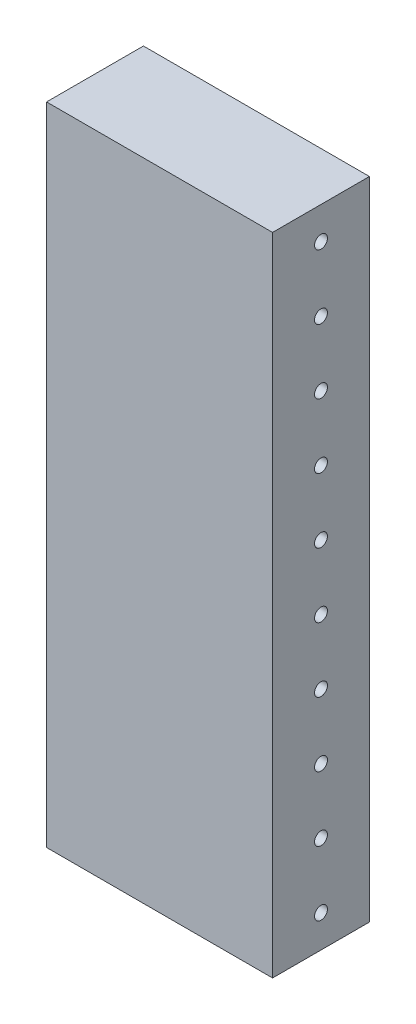
ISO-10303-21;
HEADER;
FILE_DESCRIPTION(('STEP AP214'),'2;1');
FILE_NAME('part.step','',(''),(''),'','','');
FILE_SCHEMA(('AUTOMOTIVE_DESIGN { 1 0 10303 214 1 1 1 1 }'));
ENDSEC;
DATA;
#1=APPLICATION_CONTEXT('core data for automotive mechanical design processes');
#2=APPLICATION_PROTOCOL_DEFINITION('international standard','automotive_design',2000,#1);
#3=PRODUCT_CONTEXT('',#1,'mechanical');
#4=PRODUCT('Part','Part','',(#3));
#5=PRODUCT_RELATED_PRODUCT_CATEGORY('part','',(#4));
#6=PRODUCT_DEFINITION_FORMATION('','',#4);
#7=PRODUCT_DEFINITION_CONTEXT('part definition',#1,'design');
#8=PRODUCT_DEFINITION('design','',#6,#7);
#9=PRODUCT_DEFINITION_SHAPE('','',#8);
#10=(LENGTH_UNIT() NAMED_UNIT(*) SI_UNIT(.MILLI.,.METRE.));
#11=(NAMED_UNIT(*) PLANE_ANGLE_UNIT() SI_UNIT($,.RADIAN.));
#12=(NAMED_UNIT(*) SI_UNIT($,.STERADIAN.) SOLID_ANGLE_UNIT());
#13=UNCERTAINTY_MEASURE_WITH_UNIT(LENGTH_MEASURE(1.E-05),#10,'distance_accuracy_value','');
#14=(GEOMETRIC_REPRESENTATION_CONTEXT(3) GLOBAL_UNCERTAINTY_ASSIGNED_CONTEXT((#13)) GLOBAL_UNIT_ASSIGNED_CONTEXT((#10,
#11,#12)) REPRESENTATION_CONTEXT('',''));
#15=CARTESIAN_POINT('',(0.,0.,0.));
#16=DIRECTION('',(0.,0.,1.));
#17=DIRECTION('',(1.,0.,0.));
#18=AXIS2_PLACEMENT_3D('',#15,#16,#17);
#19=CARTESIAN_POINT('',(0.,254.,0.));
#20=DIRECTION('',(1.,0.,0.));
#21=DIRECTION('',(0.,0.,-1.));
#22=AXIS2_PLACEMENT_3D('',#19,#20,#21);
#23=PLANE('',#22);
#24=CARTESIAN_POINT('',(0.,12.7,19.05));
#25=DIRECTION('',(-1.,0.,0.));
#26=DIRECTION('',(0.,0.,1.));
#27=AXIS2_PLACEMENT_3D('',#24,#25,#26);
#28=CIRCLE('',#27,2.54);
#29=CARTESIAN_POINT('',(0.,12.7,21.59));
#30=VERTEX_POINT('',#29);
#31=EDGE_CURVE('E200',#30,#30,#28,.T.);
#32=ORIENTED_EDGE('',*,*,#31,.F.);
#33=EDGE_LOOP('',(#32));
#34=FACE_BOUND('',#33,.T.);
#35=CARTESIAN_POINT('',(0.,38.1,19.05));
#36=DIRECTION('',(-1.,0.,0.));
#37=DIRECTION('',(0.,0.,1.));
#38=AXIS2_PLACEMENT_3D('',#35,#36,#37);
#39=CIRCLE('',#38,2.54);
#40=CARTESIAN_POINT('',(0.,38.1,21.59));
#41=VERTEX_POINT('',#40);
#42=EDGE_CURVE('E192',#41,#41,#39,.T.);
#43=ORIENTED_EDGE('',*,*,#42,.F.);
#44=EDGE_LOOP('',(#43));
#45=FACE_BOUND('',#44,.T.);
#46=CARTESIAN_POINT('',(0.,63.5,19.05));
#47=DIRECTION('',(-1.,0.,0.));
#48=DIRECTION('',(0.,0.,1.));
#49=AXIS2_PLACEMENT_3D('',#46,#47,#48);
#50=CIRCLE('',#49,2.54);
#51=CARTESIAN_POINT('',(0.,63.5,21.59));
#52=VERTEX_POINT('',#51);
#53=EDGE_CURVE('E184',#52,#52,#50,.T.);
#54=ORIENTED_EDGE('',*,*,#53,.F.);
#55=EDGE_LOOP('',(#54));
#56=FACE_BOUND('',#55,.T.);
#57=CARTESIAN_POINT('',(0.,88.9,19.05));
#58=DIRECTION('',(-1.,0.,0.));
#59=DIRECTION('',(0.,0.,1.));
#60=AXIS2_PLACEMENT_3D('',#57,#58,#59);
#61=CIRCLE('',#60,2.54);
#62=CARTESIAN_POINT('',(0.,88.9,21.59));
#63=VERTEX_POINT('',#62);
#64=EDGE_CURVE('E176',#63,#63,#61,.T.);
#65=ORIENTED_EDGE('',*,*,#64,.F.);
#66=EDGE_LOOP('',(#65));
#67=FACE_BOUND('',#66,.T.);
#68=CARTESIAN_POINT('',(0.,114.3,19.05));
#69=DIRECTION('',(-1.,0.,0.));
#70=DIRECTION('',(0.,0.,1.));
#71=AXIS2_PLACEMENT_3D('',#68,#69,#70);
#72=CIRCLE('',#71,2.54);
#73=CARTESIAN_POINT('',(0.,114.3,21.59));
#74=VERTEX_POINT('',#73);
#75=EDGE_CURVE('E168',#74,#74,#72,.T.);
#76=ORIENTED_EDGE('',*,*,#75,.F.);
#77=EDGE_LOOP('',(#76));
#78=FACE_BOUND('',#77,.T.);
#79=CARTESIAN_POINT('',(0.,139.7,19.05));
#80=DIRECTION('',(-1.,0.,0.));
#81=DIRECTION('',(0.,0.,1.));
#82=AXIS2_PLACEMENT_3D('',#79,#80,#81);
#83=CIRCLE('',#82,2.54);
#84=CARTESIAN_POINT('',(0.,139.7,21.59));
#85=VERTEX_POINT('',#84);
#86=EDGE_CURVE('E160',#85,#85,#83,.T.);
#87=ORIENTED_EDGE('',*,*,#86,.F.);
#88=EDGE_LOOP('',(#87));
#89=FACE_BOUND('',#88,.T.);
#90=CARTESIAN_POINT('',(0.,165.1,19.05));
#91=DIRECTION('',(-1.,0.,0.));
#92=DIRECTION('',(0.,0.,1.));
#93=AXIS2_PLACEMENT_3D('',#90,#91,#92);
#94=CIRCLE('',#93,2.54);
#95=CARTESIAN_POINT('',(0.,165.1,21.59));
#96=VERTEX_POINT('',#95);
#97=EDGE_CURVE('E152',#96,#96,#94,.T.);
#98=ORIENTED_EDGE('',*,*,#97,.F.);
#99=EDGE_LOOP('',(#98));
#100=FACE_BOUND('',#99,.T.);
#101=CARTESIAN_POINT('',(0.,190.5,19.05));
#102=DIRECTION('',(-1.,0.,0.));
#103=DIRECTION('',(0.,0.,1.));
#104=AXIS2_PLACEMENT_3D('',#101,#102,#103);
#105=CIRCLE('',#104,2.54);
#106=CARTESIAN_POINT('',(0.,190.5,21.59));
#107=VERTEX_POINT('',#106);
#108=EDGE_CURVE('E144',#107,#107,#105,.T.);
#109=ORIENTED_EDGE('',*,*,#108,.F.);
#110=EDGE_LOOP('',(#109));
#111=FACE_BOUND('',#110,.T.);
#112=CARTESIAN_POINT('',(0.,215.9,19.05));
#113=DIRECTION('',(-1.,0.,0.));
#114=DIRECTION('',(0.,0.,1.));
#115=AXIS2_PLACEMENT_3D('',#112,#113,#114);
#116=CIRCLE('',#115,2.54);
#117=CARTESIAN_POINT('',(0.,215.9,21.59));
#118=VERTEX_POINT('',#117);
#119=EDGE_CURVE('E136',#118,#118,#116,.T.);
#120=ORIENTED_EDGE('',*,*,#119,.F.);
#121=EDGE_LOOP('',(#120));
#122=FACE_BOUND('',#121,.T.);
#123=CARTESIAN_POINT('',(0.,241.3,19.05));
#124=DIRECTION('',(-1.,0.,0.));
#125=DIRECTION('',(0.,0.,1.));
#126=AXIS2_PLACEMENT_3D('',#123,#124,#125);
#127=CIRCLE('',#126,2.54);
#128=CARTESIAN_POINT('',(0.,241.3,21.59));
#129=VERTEX_POINT('',#128);
#130=EDGE_CURVE('E128',#129,#129,#127,.T.);
#131=ORIENTED_EDGE('',*,*,#130,.F.);
#132=EDGE_LOOP('',(#131));
#133=FACE_BOUND('',#132,.T.);
#134=DIRECTION('',(0.,0.,1.));
#135=VECTOR('',#134,1.);
#136=CARTESIAN_POINT('',(0.,0.,0.));
#137=LINE('',#136,#135);
#138=CARTESIAN_POINT('',(0.,0.,0.));
#139=VERTEX_POINT('',#138);
#140=CARTESIAN_POINT('',(0.,0.,38.1));
#141=VERTEX_POINT('',#140);
#142=EDGE_CURVE('E107',#139,#141,#137,.T.);
#143=ORIENTED_EDGE('',*,*,#142,.T.);
#144=DIRECTION('',(0.,-1.,0.));
#145=VECTOR('',#144,1.);
#146=CARTESIAN_POINT('',(0.,254.,38.1));
#147=LINE('',#146,#145);
#148=CARTESIAN_POINT('',(0.,254.,38.1));
#149=VERTEX_POINT('',#148);
#150=EDGE_CURVE('E11',#149,#141,#147,.T.);
#151=ORIENTED_EDGE('',*,*,#150,.F.);
#152=DIRECTION('',(0.,0.,1.));
#153=VECTOR('',#152,1.);
#154=CARTESIAN_POINT('',(0.,254.,0.));
#155=LINE('',#154,#153);
#156=CARTESIAN_POINT('',(0.,254.,0.));
#157=VERTEX_POINT('',#156);
#158=EDGE_CURVE('E91',#157,#149,#155,.T.);
#159=ORIENTED_EDGE('',*,*,#158,.F.);
#160=DIRECTION('',(0.,-1.,0.));
#161=VECTOR('',#160,1.);
#162=CARTESIAN_POINT('',(0.,254.,0.));
#163=LINE('',#162,#161);
#164=EDGE_CURVE('E103',#157,#139,#163,.T.);
#165=ORIENTED_EDGE('',*,*,#164,.T.);
#166=EDGE_LOOP('',(#143,#151,#159,#165));
#167=FACE_BOUND('',#166,.T.);
#168=ADVANCED_FACE('F39',(#34,#45,#56,#67,#78,#89,#100,#111,#122,#133,#167),#23,.F.);
#169=CARTESIAN_POINT('',(0.,254.,38.1));
#170=DIRECTION('',(0.,0.,-1.));
#171=DIRECTION('',(-1.,0.,0.));
#172=AXIS2_PLACEMENT_3D('',#169,#170,#171);
#173=PLANE('',#172);
#174=DIRECTION('',(1.,0.,0.));
#175=VECTOR('',#174,1.);
#176=CARTESIAN_POINT('',(0.,0.,38.1));
#177=LINE('',#176,#175);
#178=CARTESIAN_POINT('',(88.9,0.,38.1));
#179=VERTEX_POINT('',#178);
#180=EDGE_CURVE('E96',#141,#179,#177,.T.);
#181=ORIENTED_EDGE('',*,*,#180,.T.);
#182=DIRECTION('',(0.,-1.,0.));
#183=VECTOR('',#182,1.);
#184=CARTESIAN_POINT('',(88.9,254.,38.1));
#185=LINE('',#184,#183);
#186=CARTESIAN_POINT('',(88.9,254.,38.1));
#187=VERTEX_POINT('',#186);
#188=EDGE_CURVE('E48',#187,#179,#185,.T.);
#189=ORIENTED_EDGE('',*,*,#188,.F.);
#190=DIRECTION('',(1.,0.,0.));
#191=VECTOR('',#190,1.);
#192=CARTESIAN_POINT('',(0.,254.,38.1));
#193=LINE('',#192,#191);
#194=EDGE_CURVE('E86',#149,#187,#193,.T.);
#195=ORIENTED_EDGE('',*,*,#194,.F.);
#196=ORIENTED_EDGE('',*,*,#150,.T.);
#197=EDGE_LOOP('',(#181,#189,#195,#196));
#198=FACE_BOUND('',#197,.T.);
#199=ADVANCED_FACE('F95',(#198),#173,.F.);
#200=CARTESIAN_POINT('',(88.9,254.,0.));
#201=DIRECTION('',(-1.,0.,0.));
#202=DIRECTION('',(0.,0.,1.));
#203=AXIS2_PLACEMENT_3D('',#200,#201,#202);
#204=PLANE('',#203);
#205=CARTESIAN_POINT('',(88.9,12.7,19.05));
#206=DIRECTION('',(-1.,0.,0.));
#207=DIRECTION('',(0.,0.,1.));
#208=AXIS2_PLACEMENT_3D('',#205,#206,#207);
#209=CIRCLE('',#208,2.54);
#210=CARTESIAN_POINT('',(88.9,12.7,21.59));
#211=VERTEX_POINT('',#210);
#212=EDGE_CURVE('E111',#211,#211,#209,.T.);
#213=ORIENTED_EDGE('',*,*,#212,.T.);
#214=EDGE_LOOP('',(#213));
#215=FACE_BOUND('',#214,.T.);
#216=CARTESIAN_POINT('',(88.9,38.1,19.05));
#217=DIRECTION('',(-1.,0.,0.));
#218=DIRECTION('',(0.,0.,1.));
#219=AXIS2_PLACEMENT_3D('',#216,#217,#218);
#220=CIRCLE('',#219,2.54);
#221=CARTESIAN_POINT('',(88.9,38.1,21.59));
#222=VERTEX_POINT('',#221);
#223=EDGE_CURVE('E196',#222,#222,#220,.T.);
#224=ORIENTED_EDGE('',*,*,#223,.T.);
#225=EDGE_LOOP('',(#224));
#226=FACE_BOUND('',#225,.T.);
#227=CARTESIAN_POINT('',(88.9,63.5,19.05));
#228=DIRECTION('',(-1.,0.,0.));
#229=DIRECTION('',(0.,0.,1.));
#230=AXIS2_PLACEMENT_3D('',#227,#228,#229);
#231=CIRCLE('',#230,2.54);
#232=CARTESIAN_POINT('',(88.9,63.5,21.59));
#233=VERTEX_POINT('',#232);
#234=EDGE_CURVE('E188',#233,#233,#231,.T.);
#235=ORIENTED_EDGE('',*,*,#234,.T.);
#236=EDGE_LOOP('',(#235));
#237=FACE_BOUND('',#236,.T.);
#238=CARTESIAN_POINT('',(88.9,88.9,19.05));
#239=DIRECTION('',(-1.,0.,0.));
#240=DIRECTION('',(0.,0.,1.));
#241=AXIS2_PLACEMENT_3D('',#238,#239,#240);
#242=CIRCLE('',#241,2.54);
#243=CARTESIAN_POINT('',(88.9,88.9,21.59));
#244=VERTEX_POINT('',#243);
#245=EDGE_CURVE('E180',#244,#244,#242,.T.);
#246=ORIENTED_EDGE('',*,*,#245,.T.);
#247=EDGE_LOOP('',(#246));
#248=FACE_BOUND('',#247,.T.);
#249=CARTESIAN_POINT('',(88.9,114.3,19.05));
#250=DIRECTION('',(-1.,0.,0.));
#251=DIRECTION('',(0.,0.,1.));
#252=AXIS2_PLACEMENT_3D('',#249,#250,#251);
#253=CIRCLE('',#252,2.54);
#254=CARTESIAN_POINT('',(88.9,114.3,21.59));
#255=VERTEX_POINT('',#254);
#256=EDGE_CURVE('E172',#255,#255,#253,.T.);
#257=ORIENTED_EDGE('',*,*,#256,.T.);
#258=EDGE_LOOP('',(#257));
#259=FACE_BOUND('',#258,.T.);
#260=CARTESIAN_POINT('',(88.9,139.7,19.05));
#261=DIRECTION('',(-1.,0.,0.));
#262=DIRECTION('',(0.,0.,1.));
#263=AXIS2_PLACEMENT_3D('',#260,#261,#262);
#264=CIRCLE('',#263,2.54);
#265=CARTESIAN_POINT('',(88.9,139.7,21.59));
#266=VERTEX_POINT('',#265);
#267=EDGE_CURVE('E164',#266,#266,#264,.T.);
#268=ORIENTED_EDGE('',*,*,#267,.T.);
#269=EDGE_LOOP('',(#268));
#270=FACE_BOUND('',#269,.T.);
#271=CARTESIAN_POINT('',(88.9,165.1,19.05));
#272=DIRECTION('',(-1.,0.,0.));
#273=DIRECTION('',(0.,0.,1.));
#274=AXIS2_PLACEMENT_3D('',#271,#272,#273);
#275=CIRCLE('',#274,2.54);
#276=CARTESIAN_POINT('',(88.9,165.1,21.59));
#277=VERTEX_POINT('',#276);
#278=EDGE_CURVE('E156',#277,#277,#275,.T.);
#279=ORIENTED_EDGE('',*,*,#278,.T.);
#280=EDGE_LOOP('',(#279));
#281=FACE_BOUND('',#280,.T.);
#282=CARTESIAN_POINT('',(88.9,190.5,19.05));
#283=DIRECTION('',(-1.,0.,0.));
#284=DIRECTION('',(0.,0.,1.));
#285=AXIS2_PLACEMENT_3D('',#282,#283,#284);
#286=CIRCLE('',#285,2.54);
#287=CARTESIAN_POINT('',(88.9,190.5,21.59));
#288=VERTEX_POINT('',#287);
#289=EDGE_CURVE('E148',#288,#288,#286,.T.);
#290=ORIENTED_EDGE('',*,*,#289,.T.);
#291=EDGE_LOOP('',(#290));
#292=FACE_BOUND('',#291,.T.);
#293=CARTESIAN_POINT('',(88.9,215.9,19.05));
#294=DIRECTION('',(-1.,0.,0.));
#295=DIRECTION('',(0.,0.,1.));
#296=AXIS2_PLACEMENT_3D('',#293,#294,#295);
#297=CIRCLE('',#296,2.54);
#298=CARTESIAN_POINT('',(88.9,215.9,21.59));
#299=VERTEX_POINT('',#298);
#300=EDGE_CURVE('E140',#299,#299,#297,.T.);
#301=ORIENTED_EDGE('',*,*,#300,.T.);
#302=EDGE_LOOP('',(#301));
#303=FACE_BOUND('',#302,.T.);
#304=CARTESIAN_POINT('',(88.9,241.3,19.05));
#305=DIRECTION('',(-1.,0.,0.));
#306=DIRECTION('',(0.,0.,1.));
#307=AXIS2_PLACEMENT_3D('',#304,#305,#306);
#308=CIRCLE('',#307,2.54);
#309=CARTESIAN_POINT('',(88.9,241.3,21.59));
#310=VERTEX_POINT('',#309);
#311=EDGE_CURVE('E132',#310,#310,#308,.T.);
#312=ORIENTED_EDGE('',*,*,#311,.T.);
#313=EDGE_LOOP('',(#312));
#314=FACE_BOUND('',#313,.T.);
#315=DIRECTION('',(0.,0.,-1.));
#316=VECTOR('',#315,1.);
#317=CARTESIAN_POINT('',(88.9,0.,0.));
#318=LINE('',#317,#316);
#319=CARTESIAN_POINT('',(88.9,0.,0.));
#320=VERTEX_POINT('',#319);
#321=EDGE_CURVE('E73',#179,#320,#318,.T.);
#322=ORIENTED_EDGE('',*,*,#321,.T.);
#323=DIRECTION('',(0.,-1.,0.));
#324=VECTOR('',#323,1.);
#325=CARTESIAN_POINT('',(88.9,254.,0.));
#326=LINE('',#325,#324);
#327=CARTESIAN_POINT('',(88.9,254.,0.));
#328=VERTEX_POINT('',#327);
#329=EDGE_CURVE('E98',#328,#320,#326,.T.);
#330=ORIENTED_EDGE('',*,*,#329,.F.);
#331=DIRECTION('',(0.,0.,-1.));
#332=VECTOR('',#331,1.);
#333=CARTESIAN_POINT('',(88.9,254.,0.));
#334=LINE('',#333,#332);
#335=EDGE_CURVE('E89',#187,#328,#334,.T.);
#336=ORIENTED_EDGE('',*,*,#335,.F.);
#337=ORIENTED_EDGE('',*,*,#188,.T.);
#338=EDGE_LOOP('',(#322,#330,#336,#337));
#339=FACE_BOUND('',#338,.T.);
#340=ADVANCED_FACE('F99',(#215,#226,#237,#248,#259,#270,#281,#292,#303,#314,#339),#204,.F.);
#341=CARTESIAN_POINT('',(0.,254.,0.));
#342=DIRECTION('',(0.,0.,1.));
#343=DIRECTION('',(1.,0.,0.));
#344=AXIS2_PLACEMENT_3D('',#341,#342,#343);
#345=PLANE('',#344);
#346=DIRECTION('',(-1.,0.,0.));
#347=VECTOR('',#346,1.);
#348=CARTESIAN_POINT('',(0.,0.,0.));
#349=LINE('',#348,#347);
#350=EDGE_CURVE('E79',#320,#139,#349,.T.);
#351=ORIENTED_EDGE('',*,*,#350,.T.);
#352=ORIENTED_EDGE('',*,*,#164,.F.);
#353=DIRECTION('',(-1.,0.,0.));
#354=VECTOR('',#353,1.);
#355=CARTESIAN_POINT('',(0.,254.,0.));
#356=LINE('',#355,#354);
#357=EDGE_CURVE('E56',#328,#157,#356,.T.);
#358=ORIENTED_EDGE('',*,*,#357,.F.);
#359=ORIENTED_EDGE('',*,*,#329,.T.);
#360=EDGE_LOOP('',(#351,#352,#358,#359));
#361=FACE_BOUND('',#360,.T.);
#362=ADVANCED_FACE('F121',(#361),#345,.F.);
#363=CARTESIAN_POINT('',(0.,254.,0.));
#364=DIRECTION('',(0.,1.,0.));
#365=DIRECTION('',(0.,0.,1.));
#366=AXIS2_PLACEMENT_3D('',#363,#364,#365);
#367=PLANE('',#366);
#368=ORIENTED_EDGE('',*,*,#158,.T.);
#369=ORIENTED_EDGE('',*,*,#194,.T.);
#370=ORIENTED_EDGE('',*,*,#335,.T.);
#371=ORIENTED_EDGE('',*,*,#357,.T.);
#372=EDGE_LOOP('',(#368,#369,#370,#371));
#373=FACE_BOUND('',#372,.T.);
#374=ADVANCED_FACE('F87',(#373),#367,.T.);
#375=CARTESIAN_POINT('',(0.,0.,0.));
#376=DIRECTION('',(0.,1.,0.));
#377=DIRECTION('',(0.,0.,1.));
#378=AXIS2_PLACEMENT_3D('',#375,#376,#377);
#379=PLANE('',#378);
#380=ORIENTED_EDGE('',*,*,#142,.F.);
#381=ORIENTED_EDGE('',*,*,#350,.F.);
#382=ORIENTED_EDGE('',*,*,#321,.F.);
#383=ORIENTED_EDGE('',*,*,#180,.F.);
#384=EDGE_LOOP('',(#380,#381,#382,#383));
#385=FACE_BOUND('',#384,.T.);
#386=ADVANCED_FACE('F124',(#385),#379,.F.);
#387=CARTESIAN_POINT('',(88.9,241.3,19.05));
#388=DIRECTION('',(-1.,0.,0.));
#389=DIRECTION('',(0.,0.,1.));
#390=AXIS2_PLACEMENT_3D('',#387,#388,#389);
#391=CYLINDRICAL_SURFACE('',#390,2.54);
#392=ORIENTED_EDGE('',*,*,#311,.F.);
#393=EDGE_LOOP('',(#392));
#394=FACE_BOUND('',#393,.T.);
#395=ORIENTED_EDGE('',*,*,#130,.T.);
#396=EDGE_LOOP('',(#395));
#397=FACE_BOUND('',#396,.T.);
#398=ADVANCED_FACE('F237',(#394,#397),#391,.F.);
#399=CARTESIAN_POINT('',(88.9,215.9,19.05));
#400=DIRECTION('',(-1.,0.,0.));
#401=DIRECTION('',(0.,0.,1.));
#402=AXIS2_PLACEMENT_3D('',#399,#400,#401);
#403=CYLINDRICAL_SURFACE('',#402,2.54);
#404=ORIENTED_EDGE('',*,*,#300,.F.);
#405=EDGE_LOOP('',(#404));
#406=FACE_BOUND('',#405,.T.);
#407=ORIENTED_EDGE('',*,*,#119,.T.);
#408=EDGE_LOOP('',(#407));
#409=FACE_BOUND('',#408,.T.);
#410=ADVANCED_FACE('F239',(#406,#409),#403,.F.);
#411=CARTESIAN_POINT('',(88.9,190.5,19.05));
#412=DIRECTION('',(-1.,0.,0.));
#413=DIRECTION('',(0.,0.,1.));
#414=AXIS2_PLACEMENT_3D('',#411,#412,#413);
#415=CYLINDRICAL_SURFACE('',#414,2.54);
#416=ORIENTED_EDGE('',*,*,#289,.F.);
#417=EDGE_LOOP('',(#416));
#418=FACE_BOUND('',#417,.T.);
#419=ORIENTED_EDGE('',*,*,#108,.T.);
#420=EDGE_LOOP('',(#419));
#421=FACE_BOUND('',#420,.T.);
#422=ADVANCED_FACE('F246',(#418,#421),#415,.F.);
#423=CARTESIAN_POINT('',(88.9,165.1,19.05));
#424=DIRECTION('',(-1.,0.,0.));
#425=DIRECTION('',(0.,0.,1.));
#426=AXIS2_PLACEMENT_3D('',#423,#424,#425);
#427=CYLINDRICAL_SURFACE('',#426,2.54);
#428=ORIENTED_EDGE('',*,*,#278,.F.);
#429=EDGE_LOOP('',(#428));
#430=FACE_BOUND('',#429,.T.);
#431=ORIENTED_EDGE('',*,*,#97,.T.);
#432=EDGE_LOOP('',(#431));
#433=FACE_BOUND('',#432,.T.);
#434=ADVANCED_FACE('F310',(#430,#433),#427,.F.);
#435=CARTESIAN_POINT('',(88.9,139.7,19.05));
#436=DIRECTION('',(-1.,0.,0.));
#437=DIRECTION('',(0.,0.,1.));
#438=AXIS2_PLACEMENT_3D('',#435,#436,#437);
#439=CYLINDRICAL_SURFACE('',#438,2.54);
#440=ORIENTED_EDGE('',*,*,#267,.F.);
#441=EDGE_LOOP('',(#440));
#442=FACE_BOUND('',#441,.T.);
#443=ORIENTED_EDGE('',*,*,#86,.T.);
#444=EDGE_LOOP('',(#443));
#445=FACE_BOUND('',#444,.T.);
#446=ADVANCED_FACE('F318',(#442,#445),#439,.F.);
#447=CARTESIAN_POINT('',(88.9,114.3,19.05));
#448=DIRECTION('',(-1.,0.,0.));
#449=DIRECTION('',(0.,0.,1.));
#450=AXIS2_PLACEMENT_3D('',#447,#448,#449);
#451=CYLINDRICAL_SURFACE('',#450,2.54);
#452=ORIENTED_EDGE('',*,*,#256,.F.);
#453=EDGE_LOOP('',(#452));
#454=FACE_BOUND('',#453,.T.);
#455=ORIENTED_EDGE('',*,*,#75,.T.);
#456=EDGE_LOOP('',(#455));
#457=FACE_BOUND('',#456,.T.);
#458=ADVANCED_FACE('F327',(#454,#457),#451,.F.);
#459=CARTESIAN_POINT('',(88.9,88.9,19.05));
#460=DIRECTION('',(-1.,0.,0.));
#461=DIRECTION('',(0.,0.,1.));
#462=AXIS2_PLACEMENT_3D('',#459,#460,#461);
#463=CYLINDRICAL_SURFACE('',#462,2.54);
#464=ORIENTED_EDGE('',*,*,#245,.F.);
#465=EDGE_LOOP('',(#464));
#466=FACE_BOUND('',#465,.T.);
#467=ORIENTED_EDGE('',*,*,#64,.T.);
#468=EDGE_LOOP('',(#467));
#469=FACE_BOUND('',#468,.T.);
#470=ADVANCED_FACE('F336',(#466,#469),#463,.F.);
#471=CARTESIAN_POINT('',(88.9,63.5,19.05));
#472=DIRECTION('',(-1.,0.,0.));
#473=DIRECTION('',(0.,0.,1.));
#474=AXIS2_PLACEMENT_3D('',#471,#472,#473);
#475=CYLINDRICAL_SURFACE('',#474,2.54);
#476=ORIENTED_EDGE('',*,*,#234,.F.);
#477=EDGE_LOOP('',(#476));
#478=FACE_BOUND('',#477,.T.);
#479=ORIENTED_EDGE('',*,*,#53,.T.);
#480=EDGE_LOOP('',(#479));
#481=FACE_BOUND('',#480,.T.);
#482=ADVANCED_FACE('F345',(#478,#481),#475,.F.);
#483=CARTESIAN_POINT('',(88.9,38.1,19.05));
#484=DIRECTION('',(-1.,0.,0.));
#485=DIRECTION('',(0.,0.,1.));
#486=AXIS2_PLACEMENT_3D('',#483,#484,#485);
#487=CYLINDRICAL_SURFACE('',#486,2.54);
#488=ORIENTED_EDGE('',*,*,#223,.F.);
#489=EDGE_LOOP('',(#488));
#490=FACE_BOUND('',#489,.T.);
#491=ORIENTED_EDGE('',*,*,#42,.T.);
#492=EDGE_LOOP('',(#491));
#493=FACE_BOUND('',#492,.T.);
#494=ADVANCED_FACE('F213',(#490,#493),#487,.F.);
#495=CARTESIAN_POINT('',(88.9,12.7,19.05));
#496=DIRECTION('',(-1.,0.,0.));
#497=DIRECTION('',(0.,0.,1.));
#498=AXIS2_PLACEMENT_3D('',#495,#496,#497);
#499=CYLINDRICAL_SURFACE('',#498,2.54);
#500=ORIENTED_EDGE('',*,*,#212,.F.);
#501=EDGE_LOOP('',(#500));
#502=FACE_BOUND('',#501,.T.);
#503=ORIENTED_EDGE('',*,*,#31,.T.);
#504=EDGE_LOOP('',(#503));
#505=FACE_BOUND('',#504,.T.);
#506=ADVANCED_FACE('F210',(#502,#505),#499,.F.);
#507=CLOSED_SHELL('',(#168,#199,#340,#362,#374,#386,#398,#410,#422,#434,#446,#458,#470,#482,
#494,#506));
#508=MANIFOLD_SOLID_BREP('B2',#507);
#509=ADVANCED_BREP_SHAPE_REPRESENTATION('',(#18,#508),#14);
#510=SHAPE_DEFINITION_REPRESENTATION(#9,#509);
ENDSEC;
END-ISO-10303-21;
